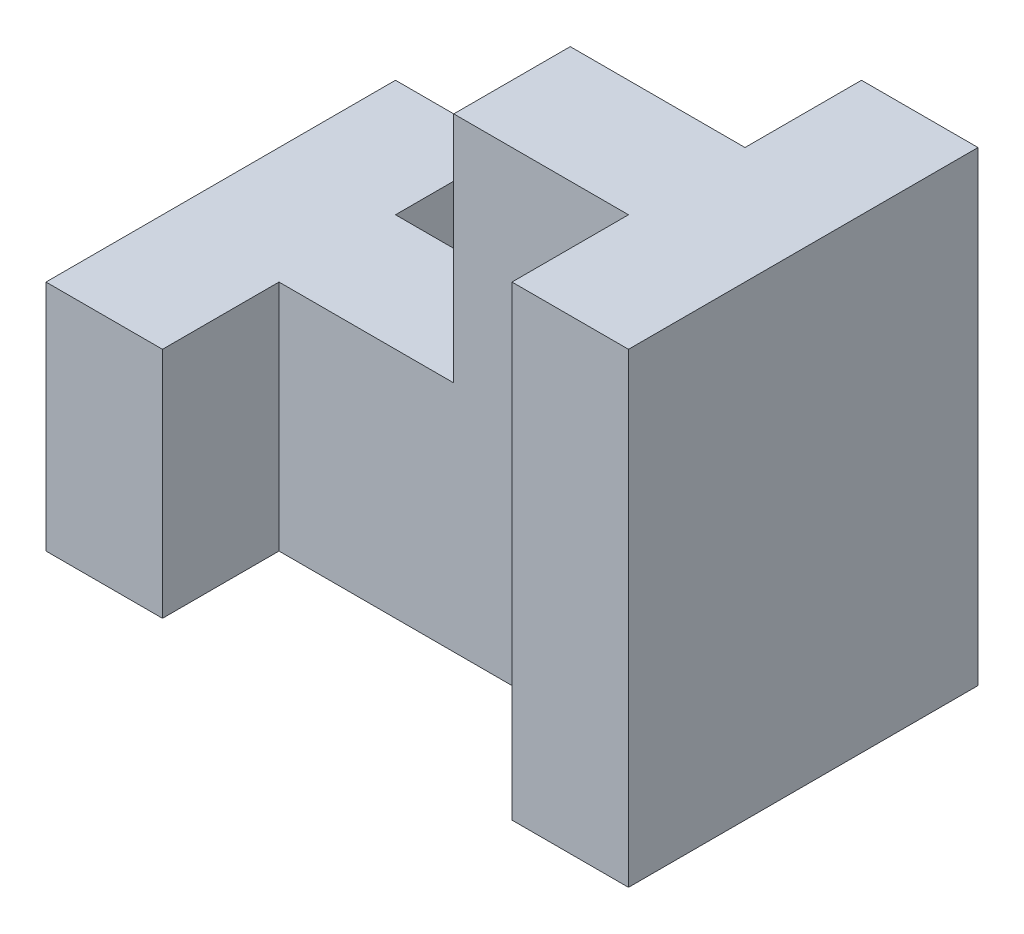
ISO-10303-21;
HEADER;
FILE_DESCRIPTION(('STEP AP214'),'2;1');
FILE_NAME('part.step','',(''),(''),'','','');
FILE_SCHEMA(('AUTOMOTIVE_DESIGN { 1 0 10303 214 1 1 1 1 }'));
ENDSEC;
DATA;
#1=APPLICATION_CONTEXT('core data for automotive mechanical design processes');
#2=APPLICATION_PROTOCOL_DEFINITION('international standard','automotive_design',2000,#1);
#3=PRODUCT_CONTEXT('',#1,'mechanical');
#4=PRODUCT('Part','Part','',(#3));
#5=PRODUCT_RELATED_PRODUCT_CATEGORY('part','',(#4));
#6=PRODUCT_DEFINITION_FORMATION('','',#4);
#7=PRODUCT_DEFINITION_CONTEXT('part definition',#1,'design');
#8=PRODUCT_DEFINITION('design','',#6,#7);
#9=PRODUCT_DEFINITION_SHAPE('','',#8);
#10=(LENGTH_UNIT() NAMED_UNIT(*) SI_UNIT(.MILLI.,.METRE.));
#11=(NAMED_UNIT(*) PLANE_ANGLE_UNIT() SI_UNIT($,.RADIAN.));
#12=(NAMED_UNIT(*) SI_UNIT($,.STERADIAN.) SOLID_ANGLE_UNIT());
#13=UNCERTAINTY_MEASURE_WITH_UNIT(LENGTH_MEASURE(1.E-05),#10,'distance_accuracy_value','');
#14=(GEOMETRIC_REPRESENTATION_CONTEXT(3) GLOBAL_UNCERTAINTY_ASSIGNED_CONTEXT((#13)) GLOBAL_UNIT_ASSIGNED_CONTEXT((#10,
#11,#12)) REPRESENTATION_CONTEXT('',''));
#15=CARTESIAN_POINT('',(0.,0.,0.));
#16=DIRECTION('',(0.,0.,1.));
#17=DIRECTION('',(1.,0.,0.));
#18=AXIS2_PLACEMENT_3D('',#15,#16,#17);
#19=CARTESIAN_POINT('',(0.,40.,0.));
#20=DIRECTION('',(0.,-1.,0.));
#21=DIRECTION('',(0.,0.,-1.));
#22=AXIS2_PLACEMENT_3D('',#19,#20,#21);
#23=PLANE('',#22);
#24=DIRECTION('',(-1.,0.,0.));
#25=VECTOR('',#24,1.);
#26=CARTESIAN_POINT('',(50.1,40.,40.));
#27=LINE('',#26,#25);
#28=CARTESIAN_POINT('',(50.,40.,40.));
#29=VERTEX_POINT('',#28);
#30=CARTESIAN_POINT('',(20.,40.,40.));
#31=VERTEX_POINT('',#30);
#32=EDGE_CURVE('E554',#29,#31,#27,.T.);
#33=ORIENTED_EDGE('',*,*,#32,.F.);
#34=DIRECTION('',(0.,0.,-1.));
#35=VECTOR('',#34,1.);
#36=CARTESIAN_POINT('',(50.,40.,0.));
#37=LINE('',#36,#35);
#38=CARTESIAN_POINT('',(50.,40.,20.));
#39=VERTEX_POINT('',#38);
#40=EDGE_CURVE('E397',#29,#39,#37,.T.);
#41=ORIENTED_EDGE('',*,*,#40,.T.);
#42=DIRECTION('',(1.,0.,0.));
#43=VECTOR('',#42,1.);
#44=CARTESIAN_POINT('',(20.,40.,20.));
#45=LINE('',#44,#43);
#46=CARTESIAN_POINT('',(20.,40.,20.));
#47=VERTEX_POINT('',#46);
#48=EDGE_CURVE('E550',#47,#39,#45,.T.);
#49=ORIENTED_EDGE('',*,*,#48,.F.);
#50=DIRECTION('',(0.,0.,1.));
#51=VECTOR('',#50,1.);
#52=CARTESIAN_POINT('',(20.,40.,0.));
#53=LINE('',#52,#51);
#54=CARTESIAN_POINT('',(20.,40.,0.));
#55=VERTEX_POINT('',#54);
#56=EDGE_CURVE('E555',#55,#47,#53,.T.);
#57=ORIENTED_EDGE('',*,*,#56,.F.);
#58=DIRECTION('',(1.,0.,0.));
#59=VECTOR('',#58,1.);
#60=CARTESIAN_POINT('',(0.,40.,0.));
#61=LINE('',#60,#59);
#62=CARTESIAN_POINT('',(0.,40.,0.));
#63=VERTEX_POINT('',#62);
#64=EDGE_CURVE('E580',#63,#55,#61,.T.);
#65=ORIENTED_EDGE('',*,*,#64,.F.);
#66=DIRECTION('',(0.,0.,-1.));
#67=VECTOR('',#66,1.);
#68=CARTESIAN_POINT('',(0.,40.,60.));
#69=LINE('',#68,#67);
#70=CARTESIAN_POINT('',(0.,40.,60.));
#71=VERTEX_POINT('',#70);
#72=EDGE_CURVE('E592',#71,#63,#69,.T.);
#73=ORIENTED_EDGE('',*,*,#72,.F.);
#74=DIRECTION('',(-1.,0.,0.));
#75=VECTOR('',#74,1.);
#76=CARTESIAN_POINT('',(20.,40.,60.));
#77=LINE('',#76,#75);
#78=CARTESIAN_POINT('',(20.,40.,60.));
#79=VERTEX_POINT('',#78);
#80=EDGE_CURVE('E12',#79,#71,#77,.T.);
#81=ORIENTED_EDGE('',*,*,#80,.F.);
#82=DIRECTION('',(0.,0.,1.));
#83=VECTOR('',#82,1.);
#84=CARTESIAN_POINT('',(20.,40.,40.));
#85=LINE('',#84,#83);
#86=EDGE_CURVE('E88',#31,#79,#85,.T.);
#87=ORIENTED_EDGE('',*,*,#86,.F.);
#88=EDGE_LOOP('',(#33,#41,#49,#57,#65,#73,#81,#87));
#89=FACE_BOUND('',#88,.T.);
#90=ADVANCED_FACE('F77',(#89),#23,.F.);
#91=CARTESIAN_POINT('',(0.,0.,0.));
#92=DIRECTION('',(0.,-1.,0.));
#93=DIRECTION('',(0.,0.,-1.));
#94=AXIS2_PLACEMENT_3D('',#91,#92,#93);
#95=PLANE('',#94);
#96=DIRECTION('',(1.,0.,0.));
#97=VECTOR('',#96,1.);
#98=CARTESIAN_POINT('',(20.,0.,20.));
#99=LINE('',#98,#97);
#100=CARTESIAN_POINT('',(20.,0.,20.));
#101=VERTEX_POINT('',#100);
#102=CARTESIAN_POINT('',(50.,0.,20.));
#103=VERTEX_POINT('',#102);
#104=EDGE_CURVE('E348',#101,#103,#99,.T.);
#105=ORIENTED_EDGE('',*,*,#104,.T.);
#106=CARTESIAN_POINT('',(50.1,0.,20.));
#107=VERTEX_POINT('',#106);
#108=EDGE_CURVE('E105',#103,#107,#99,.T.);
#109=ORIENTED_EDGE('',*,*,#108,.T.);
#110=DIRECTION('',(1.,0.,0.));
#111=VECTOR('',#110,1.);
#112=CARTESIAN_POINT('',(50.,0.,20.));
#113=LINE('',#112,#111);
#114=CARTESIAN_POINT('',(80.,0.,20.));
#115=VERTEX_POINT('',#114);
#116=EDGE_CURVE('E341',#107,#115,#113,.T.);
#117=ORIENTED_EDGE('',*,*,#116,.T.);
#118=DIRECTION('',(0.,0.,-1.));
#119=VECTOR('',#118,1.);
#120=CARTESIAN_POINT('',(80.,0.,20.));
#121=LINE('',#120,#119);
#122=CARTESIAN_POINT('',(80.,0.,0.));
#123=VERTEX_POINT('',#122);
#124=EDGE_CURVE('E331',#115,#123,#121,.T.);
#125=ORIENTED_EDGE('',*,*,#124,.T.);
#126=DIRECTION('',(1.,0.,0.));
#127=VECTOR('',#126,1.);
#128=CARTESIAN_POINT('',(80.,0.,0.));
#129=LINE('',#128,#127);
#130=CARTESIAN_POINT('',(100.,0.,0.));
#131=VERTEX_POINT('',#130);
#132=EDGE_CURVE('E323',#123,#131,#129,.T.);
#133=ORIENTED_EDGE('',*,*,#132,.T.);
#134=DIRECTION('',(0.,0.,1.));
#135=VECTOR('',#134,1.);
#136=CARTESIAN_POINT('',(100.,0.,0.));
#137=LINE('',#136,#135);
#138=CARTESIAN_POINT('',(100.,0.,60.));
#139=VERTEX_POINT('',#138);
#140=EDGE_CURVE('E321',#131,#139,#137,.T.);
#141=ORIENTED_EDGE('',*,*,#140,.T.);
#142=DIRECTION('',(-1.,0.,0.));
#143=VECTOR('',#142,1.);
#144=CARTESIAN_POINT('',(100.,0.,60.));
#145=LINE('',#144,#143);
#146=CARTESIAN_POINT('',(80.,0.,60.));
#147=VERTEX_POINT('',#146);
#148=EDGE_CURVE('E227',#139,#147,#145,.T.);
#149=ORIENTED_EDGE('',*,*,#148,.T.);
#150=DIRECTION('',(0.,0.,-1.));
#151=VECTOR('',#150,1.);
#152=CARTESIAN_POINT('',(80.,0.,60.));
#153=LINE('',#152,#151);
#154=CARTESIAN_POINT('',(80.,0.,40.));
#155=VERTEX_POINT('',#154);
#156=EDGE_CURVE('E202',#147,#155,#153,.T.);
#157=ORIENTED_EDGE('',*,*,#156,.T.);
#158=DIRECTION('',(-1.,0.,0.));
#159=VECTOR('',#158,1.);
#160=CARTESIAN_POINT('',(80.,0.,40.));
#161=LINE('',#160,#159);
#162=CARTESIAN_POINT('',(50.1,0.,40.));
#163=VERTEX_POINT('',#162);
#164=EDGE_CURVE('E213',#155,#163,#161,.T.);
#165=ORIENTED_EDGE('',*,*,#164,.T.);
#166=DIRECTION('',(-1.,0.,0.));
#167=VECTOR('',#166,1.);
#168=CARTESIAN_POINT('',(50.1,0.,40.));
#169=LINE('',#168,#167);
#170=CARTESIAN_POINT('',(50.,0.,40.));
#171=VERTEX_POINT('',#170);
#172=EDGE_CURVE('E217',#163,#171,#169,.T.);
#173=ORIENTED_EDGE('',*,*,#172,.T.);
#174=CARTESIAN_POINT('',(20.,0.,40.));
#175=VERTEX_POINT('',#174);
#176=EDGE_CURVE('E96',#171,#175,#169,.T.);
#177=ORIENTED_EDGE('',*,*,#176,.T.);
#178=DIRECTION('',(0.,0.,1.));
#179=VECTOR('',#178,1.);
#180=CARTESIAN_POINT('',(20.,0.,40.));
#181=LINE('',#180,#179);
#182=CARTESIAN_POINT('',(20.,0.,60.));
#183=VERTEX_POINT('',#182);
#184=EDGE_CURVE('E628',#175,#183,#181,.T.);
#185=ORIENTED_EDGE('',*,*,#184,.T.);
#186=DIRECTION('',(-1.,0.,0.));
#187=VECTOR('',#186,1.);
#188=CARTESIAN_POINT('',(20.,0.,60.));
#189=LINE('',#188,#187);
#190=CARTESIAN_POINT('',(0.,0.,60.));
#191=VERTEX_POINT('',#190);
#192=EDGE_CURVE('E627',#183,#191,#189,.T.);
#193=ORIENTED_EDGE('',*,*,#192,.T.);
#194=DIRECTION('',(0.,0.,-1.));
#195=VECTOR('',#194,1.);
#196=CARTESIAN_POINT('',(0.,0.,60.));
#197=LINE('',#196,#195);
#198=CARTESIAN_POINT('',(0.,0.,0.));
#199=VERTEX_POINT('',#198);
#200=EDGE_CURVE('E399',#191,#199,#197,.T.);
#201=ORIENTED_EDGE('',*,*,#200,.T.);
#202=DIRECTION('',(1.,0.,0.));
#203=VECTOR('',#202,1.);
#204=CARTESIAN_POINT('',(0.,0.,0.));
#205=LINE('',#204,#203);
#206=CARTESIAN_POINT('',(20.,0.,0.));
#207=VERTEX_POINT('',#206);
#208=EDGE_CURVE('E644',#199,#207,#205,.T.);
#209=ORIENTED_EDGE('',*,*,#208,.T.);
#210=DIRECTION('',(0.,0.,1.));
#211=VECTOR('',#210,1.);
#212=CARTESIAN_POINT('',(20.,0.,0.));
#213=LINE('',#212,#211);
#214=EDGE_CURVE('E643',#207,#101,#213,.T.);
#215=ORIENTED_EDGE('',*,*,#214,.T.);
#216=EDGE_LOOP('',(#105,#109,#117,#125,#133,#141,#149,#157,#165,#173,#177,#185,#193,#201,#209,#215));
#217=FACE_BOUND('',#216,.T.);
#218=ADVANCED_FACE('F225',(#217),#95,.T.);
#219=CARTESIAN_POINT('',(0.,0.,0.));
#220=DIRECTION('',(-1.,0.,0.));
#221=DIRECTION('',(0.,0.,1.));
#222=AXIS2_PLACEMENT_3D('',#219,#220,#221);
#223=PLANE('',#222);
#224=CARTESIAN_POINT('',(0.,0.,60.));
#225=DIRECTION('',(0.,1.,0.));
#226=VECTOR('',#225,1.);
#227=LINE('',#224,#226);
#228=EDGE_CURVE('E421',#191,#71,#227,.T.);
#229=ORIENTED_EDGE('',*,*,#228,.T.);
#230=ORIENTED_EDGE('',*,*,#72,.T.);
#231=CARTESIAN_POINT('',(0.,0.,0.));
#232=DIRECTION('',(0.,1.,0.));
#233=VECTOR('',#232,1.);
#234=LINE('',#231,#233);
#235=EDGE_CURVE('E409',#199,#63,#234,.T.);
#236=ORIENTED_EDGE('',*,*,#235,.F.);
#237=ORIENTED_EDGE('',*,*,#200,.F.);
#238=EDGE_LOOP('',(#229,#230,#236,#237));
#239=FACE_BOUND('',#238,.T.);
#240=ADVANCED_FACE('F243',(#239),#223,.T.);
#241=CARTESIAN_POINT('',(0.,0.,0.));
#242=DIRECTION('',(0.,0.,-1.));
#243=DIRECTION('',(-1.,0.,0.));
#244=AXIS2_PLACEMENT_3D('',#241,#242,#243);
#245=PLANE('',#244);
#246=ORIENTED_EDGE('',*,*,#235,.T.);
#247=ORIENTED_EDGE('',*,*,#64,.T.);
#248=CARTESIAN_POINT('',(20.,0.,0.));
#249=DIRECTION('',(0.,1.,0.));
#250=VECTOR('',#249,1.);
#251=LINE('',#248,#250);
#252=EDGE_CURVE('E435',#207,#55,#251,.T.);
#253=ORIENTED_EDGE('',*,*,#252,.F.);
#254=ORIENTED_EDGE('',*,*,#208,.F.);
#255=EDGE_LOOP('',(#246,#247,#253,#254));
#256=FACE_BOUND('',#255,.T.);
#257=ADVANCED_FACE('F441',(#256),#245,.T.);
#258=CARTESIAN_POINT('',(0.,0.,60.));
#259=DIRECTION('',(0.,0.,1.));
#260=DIRECTION('',(1.,0.,0.));
#261=AXIS2_PLACEMENT_3D('',#258,#259,#260);
#262=PLANE('',#261);
#263=CARTESIAN_POINT('',(20.,0.,60.));
#264=DIRECTION('',(0.,1.,0.));
#265=VECTOR('',#264,1.);
#266=LINE('',#263,#265);
#267=EDGE_CURVE('E624',#183,#79,#266,.T.);
#268=ORIENTED_EDGE('',*,*,#267,.T.);
#269=ORIENTED_EDGE('',*,*,#80,.T.);
#270=ORIENTED_EDGE('',*,*,#228,.F.);
#271=ORIENTED_EDGE('',*,*,#192,.F.);
#272=EDGE_LOOP('',(#268,#269,#270,#271));
#273=FACE_BOUND('',#272,.T.);
#274=ADVANCED_FACE('F450',(#273),#262,.T.);
#275=CARTESIAN_POINT('',(20.,0.,0.));
#276=DIRECTION('',(1.,0.,0.));
#277=DIRECTION('',(0.,0.,-1.));
#278=AXIS2_PLACEMENT_3D('',#275,#276,#277);
#279=PLANE('',#278);
#280=CARTESIAN_POINT('',(20.,0.,40.));
#281=DIRECTION('',(0.,1.,0.));
#282=VECTOR('',#281,1.);
#283=LINE('',#280,#282);
#284=EDGE_CURVE('E621',#175,#31,#283,.T.);
#285=ORIENTED_EDGE('',*,*,#284,.T.);
#286=ORIENTED_EDGE('',*,*,#86,.T.);
#287=ORIENTED_EDGE('',*,*,#267,.F.);
#288=ORIENTED_EDGE('',*,*,#184,.F.);
#289=EDGE_LOOP('',(#285,#286,#287,#288));
#290=FACE_BOUND('',#289,.T.);
#291=ADVANCED_FACE('F504',(#290),#279,.T.);
#292=CARTESIAN_POINT('',(0.,0.,40.));
#293=DIRECTION('',(0.,0.,1.));
#294=DIRECTION('',(1.,0.,0.));
#295=AXIS2_PLACEMENT_3D('',#292,#293,#294);
#296=PLANE('',#295);
#297=CARTESIAN_POINT('',(50.,40.,40.));
#298=DIRECTION('',(0.,1.,0.));
#299=VECTOR('',#298,1.);
#300=LINE('',#297,#299);
#301=CARTESIAN_POINT('',(50.,80.,40.));
#302=VERTEX_POINT('',#301);
#303=EDGE_CURVE('E220',#29,#302,#300,.T.);
#304=ORIENTED_EDGE('',*,*,#303,.F.);
#305=ORIENTED_EDGE('',*,*,#32,.T.);
#306=ORIENTED_EDGE('',*,*,#284,.F.);
#307=ORIENTED_EDGE('',*,*,#176,.F.);
#308=ORIENTED_EDGE('',*,*,#172,.F.);
#309=ORIENTED_EDGE('',*,*,#164,.F.);
#310=CARTESIAN_POINT('',(80.,0.,40.));
#311=DIRECTION('',(0.,1.,0.));
#312=VECTOR('',#311,1.);
#313=LINE('',#310,#312);
#314=CARTESIAN_POINT('',(80.,80.,40.));
#315=VERTEX_POINT('',#314);
#316=EDGE_CURVE('E196',#155,#315,#313,.T.);
#317=ORIENTED_EDGE('',*,*,#316,.T.);
#318=DIRECTION('',(-1.,0.,0.));
#319=VECTOR('',#318,1.);
#320=CARTESIAN_POINT('',(80.,80.,40.));
#321=LINE('',#320,#319);
#322=EDGE_CURVE('E400',#315,#302,#321,.T.);
#323=ORIENTED_EDGE('',*,*,#322,.T.);
#324=EDGE_LOOP('',(#304,#305,#306,#307,#308,#309,#317,#323));
#325=FACE_BOUND('',#324,.T.);
#326=ADVANCED_FACE('F216',(#325),#296,.T.);
#327=CARTESIAN_POINT('',(0.,0.,20.));
#328=DIRECTION('',(0.,0.,-1.));
#329=DIRECTION('',(-1.,0.,0.));
#330=AXIS2_PLACEMENT_3D('',#327,#328,#329);
#331=PLANE('',#330);
#332=ORIENTED_EDGE('',*,*,#48,.T.);
#333=CARTESIAN_POINT('',(50.,40.,20.));
#334=DIRECTION('',(0.,1.,0.));
#335=VECTOR('',#334,1.);
#336=LINE('',#333,#335);
#337=CARTESIAN_POINT('',(50.,80.,20.));
#338=VERTEX_POINT('',#337);
#339=EDGE_CURVE('E210',#39,#338,#336,.T.);
#340=ORIENTED_EDGE('',*,*,#339,.T.);
#341=DIRECTION('',(1.,0.,0.));
#342=VECTOR('',#341,1.);
#343=CARTESIAN_POINT('',(50.,80.,20.));
#344=LINE('',#343,#342);
#345=CARTESIAN_POINT('',(80.,80.,20.));
#346=VERTEX_POINT('',#345);
#347=EDGE_CURVE('E977',#338,#346,#344,.T.);
#348=ORIENTED_EDGE('',*,*,#347,.T.);
#349=CARTESIAN_POINT('',(80.,0.,20.));
#350=DIRECTION('',(0.,1.,0.));
#351=VECTOR('',#350,1.);
#352=LINE('',#349,#351);
#353=EDGE_CURVE('E945',#115,#346,#352,.T.);
#354=ORIENTED_EDGE('',*,*,#353,.F.);
#355=ORIENTED_EDGE('',*,*,#116,.F.);
#356=ORIENTED_EDGE('',*,*,#108,.F.);
#357=ORIENTED_EDGE('',*,*,#104,.F.);
#358=CARTESIAN_POINT('',(20.,0.,20.));
#359=DIRECTION('',(0.,1.,0.));
#360=VECTOR('',#359,1.);
#361=LINE('',#358,#360);
#362=EDGE_CURVE('E617',#101,#47,#361,.T.);
#363=ORIENTED_EDGE('',*,*,#362,.T.);
#364=EDGE_LOOP('',(#332,#340,#348,#354,#355,#356,#357,#363));
#365=FACE_BOUND('',#364,.T.);
#366=ADVANCED_FACE('F663',(#365),#331,.T.);
#367=CARTESIAN_POINT('',(20.,0.,0.));
#368=DIRECTION('',(1.,0.,0.));
#369=DIRECTION('',(0.,0.,-1.));
#370=AXIS2_PLACEMENT_3D('',#367,#368,#369);
#371=PLANE('',#370);
#372=ORIENTED_EDGE('',*,*,#252,.T.);
#373=ORIENTED_EDGE('',*,*,#56,.T.);
#374=ORIENTED_EDGE('',*,*,#362,.F.);
#375=ORIENTED_EDGE('',*,*,#214,.F.);
#376=EDGE_LOOP('',(#372,#373,#374,#375));
#377=FACE_BOUND('',#376,.T.);
#378=ADVANCED_FACE('F373',(#377),#371,.T.);
#379=CARTESIAN_POINT('',(50.,0.,0.));
#380=DIRECTION('',(-1.,0.,0.));
#381=DIRECTION('',(0.,0.,1.));
#382=AXIS2_PLACEMENT_3D('',#379,#380,#381);
#383=PLANE('',#382);
#384=ORIENTED_EDGE('',*,*,#40,.F.);
#385=ORIENTED_EDGE('',*,*,#303,.T.);
#386=DIRECTION('',(0.,0.,-1.));
#387=VECTOR('',#386,1.);
#388=CARTESIAN_POINT('',(50.,80.,40.));
#389=LINE('',#388,#387);
#390=EDGE_CURVE('E1022',#302,#338,#389,.T.);
#391=ORIENTED_EDGE('',*,*,#390,.T.);
#392=ORIENTED_EDGE('',*,*,#339,.F.);
#393=EDGE_LOOP('',(#384,#385,#391,#392));
#394=FACE_BOUND('',#393,.T.);
#395=ADVANCED_FACE('F364',(#394),#383,.T.);
#396=CARTESIAN_POINT('',(0.,80.,0.));
#397=DIRECTION('',(0.,-1.,0.));
#398=DIRECTION('',(0.,0.,-1.));
#399=AXIS2_PLACEMENT_3D('',#396,#397,#398);
#400=PLANE('',#399);
#401=ORIENTED_EDGE('',*,*,#390,.F.);
#402=ORIENTED_EDGE('',*,*,#322,.F.);
#403=DIRECTION('',(0.,0.,-1.));
#404=VECTOR('',#403,1.);
#405=CARTESIAN_POINT('',(80.,80.,60.));
#406=LINE('',#405,#404);
#407=CARTESIAN_POINT('',(80.,80.,60.));
#408=VERTEX_POINT('',#407);
#409=EDGE_CURVE('E205',#408,#315,#406,.T.);
#410=ORIENTED_EDGE('',*,*,#409,.F.);
#411=DIRECTION('',(-1.,0.,0.));
#412=VECTOR('',#411,1.);
#413=CARTESIAN_POINT('',(100.,80.,60.));
#414=LINE('',#413,#412);
#415=CARTESIAN_POINT('',(100.,80.,60.));
#416=VERTEX_POINT('',#415);
#417=EDGE_CURVE('E883',#416,#408,#414,.T.);
#418=ORIENTED_EDGE('',*,*,#417,.F.);
#419=DIRECTION('',(0.,0.,1.));
#420=VECTOR('',#419,1.);
#421=CARTESIAN_POINT('',(100.,80.,0.));
#422=LINE('',#421,#420);
#423=CARTESIAN_POINT('',(100.,80.,0.));
#424=VERTEX_POINT('',#423);
#425=EDGE_CURVE('E1044',#424,#416,#422,.T.);
#426=ORIENTED_EDGE('',*,*,#425,.F.);
#427=DIRECTION('',(1.,0.,0.));
#428=VECTOR('',#427,1.);
#429=CARTESIAN_POINT('',(80.,80.,0.));
#430=LINE('',#429,#428);
#431=CARTESIAN_POINT('',(80.,80.,0.));
#432=VERTEX_POINT('',#431);
#433=EDGE_CURVE('E1036',#432,#424,#430,.T.);
#434=ORIENTED_EDGE('',*,*,#433,.F.);
#435=DIRECTION('',(0.,0.,-1.));
#436=VECTOR('',#435,1.);
#437=CARTESIAN_POINT('',(80.,80.,20.));
#438=LINE('',#437,#436);
#439=EDGE_CURVE('E943',#346,#432,#438,.T.);
#440=ORIENTED_EDGE('',*,*,#439,.F.);
#441=ORIENTED_EDGE('',*,*,#347,.F.);
#442=EDGE_LOOP('',(#401,#402,#410,#418,#426,#434,#440,#441));
#443=FACE_BOUND('',#442,.T.);
#444=ADVANCED_FACE('F244',(#443),#400,.F.);
#445=CARTESIAN_POINT('',(80.,0.,0.));
#446=DIRECTION('',(-1.,0.,0.));
#447=DIRECTION('',(0.,0.,1.));
#448=AXIS2_PLACEMENT_3D('',#445,#446,#447);
#449=PLANE('',#448);
#450=CARTESIAN_POINT('',(80.,0.,60.));
#451=DIRECTION('',(0.,1.,0.));
#452=VECTOR('',#451,1.);
#453=LINE('',#450,#452);
#454=EDGE_CURVE('E209',#147,#408,#453,.T.);
#455=ORIENTED_EDGE('',*,*,#454,.T.);
#456=ORIENTED_EDGE('',*,*,#409,.T.);
#457=ORIENTED_EDGE('',*,*,#316,.F.);
#458=ORIENTED_EDGE('',*,*,#156,.F.);
#459=EDGE_LOOP('',(#455,#456,#457,#458));
#460=FACE_BOUND('',#459,.T.);
#461=ADVANCED_FACE('F200',(#460),#449,.T.);
#462=CARTESIAN_POINT('',(0.,0.,60.));
#463=DIRECTION('',(0.,0.,1.));
#464=DIRECTION('',(1.,0.,0.));
#465=AXIS2_PLACEMENT_3D('',#462,#463,#464);
#466=PLANE('',#465);
#467=CARTESIAN_POINT('',(100.,0.,60.));
#468=DIRECTION('',(0.,1.,0.));
#469=VECTOR('',#468,1.);
#470=LINE('',#467,#469);
#471=EDGE_CURVE('E1070',#139,#416,#470,.T.);
#472=ORIENTED_EDGE('',*,*,#471,.T.);
#473=ORIENTED_EDGE('',*,*,#417,.T.);
#474=ORIENTED_EDGE('',*,*,#454,.F.);
#475=ORIENTED_EDGE('',*,*,#148,.F.);
#476=EDGE_LOOP('',(#472,#473,#474,#475));
#477=FACE_BOUND('',#476,.T.);
#478=ADVANCED_FACE('F764',(#477),#466,.T.);
#479=CARTESIAN_POINT('',(100.,0.,0.));
#480=DIRECTION('',(1.,0.,0.));
#481=DIRECTION('',(0.,0.,-1.));
#482=AXIS2_PLACEMENT_3D('',#479,#480,#481);
#483=PLANE('',#482);
#484=CARTESIAN_POINT('',(100.,0.,0.));
#485=DIRECTION('',(0.,1.,0.));
#486=VECTOR('',#485,1.);
#487=LINE('',#484,#486);
#488=EDGE_CURVE('E939',#131,#424,#487,.T.);
#489=ORIENTED_EDGE('',*,*,#488,.T.);
#490=ORIENTED_EDGE('',*,*,#425,.T.);
#491=ORIENTED_EDGE('',*,*,#471,.F.);
#492=ORIENTED_EDGE('',*,*,#140,.F.);
#493=EDGE_LOOP('',(#489,#490,#491,#492));
#494=FACE_BOUND('',#493,.T.);
#495=ADVANCED_FACE('F771',(#494),#483,.T.);
#496=CARTESIAN_POINT('',(0.,0.,0.));
#497=DIRECTION('',(0.,0.,-1.));
#498=DIRECTION('',(-1.,0.,0.));
#499=AXIS2_PLACEMENT_3D('',#496,#497,#498);
#500=PLANE('',#499);
#501=CARTESIAN_POINT('',(80.,0.,0.));
#502=DIRECTION('',(0.,1.,0.));
#503=VECTOR('',#502,1.);
#504=LINE('',#501,#503);
#505=EDGE_CURVE('E937',#123,#432,#504,.T.);
#506=ORIENTED_EDGE('',*,*,#505,.T.);
#507=ORIENTED_EDGE('',*,*,#433,.T.);
#508=ORIENTED_EDGE('',*,*,#488,.F.);
#509=ORIENTED_EDGE('',*,*,#132,.F.);
#510=EDGE_LOOP('',(#506,#507,#508,#509));
#511=FACE_BOUND('',#510,.T.);
#512=ADVANCED_FACE('F779',(#511),#500,.T.);
#513=CARTESIAN_POINT('',(80.,0.,0.));
#514=DIRECTION('',(-1.,0.,0.));
#515=DIRECTION('',(0.,0.,1.));
#516=AXIS2_PLACEMENT_3D('',#513,#514,#515);
#517=PLANE('',#516);
#518=ORIENTED_EDGE('',*,*,#353,.T.);
#519=ORIENTED_EDGE('',*,*,#439,.T.);
#520=ORIENTED_EDGE('',*,*,#505,.F.);
#521=ORIENTED_EDGE('',*,*,#124,.F.);
#522=EDGE_LOOP('',(#518,#519,#520,#521));
#523=FACE_BOUND('',#522,.T.);
#524=ADVANCED_FACE('F787',(#523),#517,.T.);
#525=CLOSED_SHELL('',(#90,#218,#240,#257,#274,#291,#326,#366,#378,#395,#444,#461,#478,#495,#512,#524));
#526=MANIFOLD_SOLID_BREP('B2',#525);
#527=ADVANCED_BREP_SHAPE_REPRESENTATION('',(#18,#526),#14);
#528=SHAPE_DEFINITION_REPRESENTATION(#9,#527);
ENDSEC;
END-ISO-10303-21;
